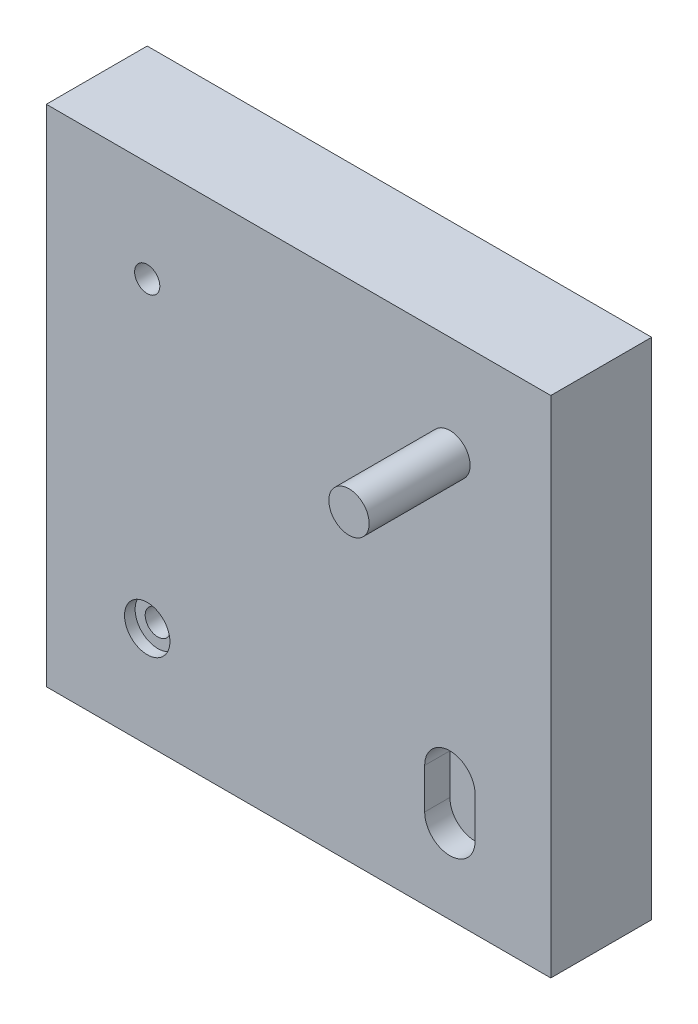
ISO-10303-21;
HEADER;
FILE_DESCRIPTION(('STEP AP214'),'2;1');
FILE_NAME('part.step','',(''),(''),'','','');
FILE_SCHEMA(('AUTOMOTIVE_DESIGN { 1 0 10303 214 1 1 1 1 }'));
ENDSEC;
DATA;
#1=APPLICATION_CONTEXT('core data for automotive mechanical design processes');
#2=APPLICATION_PROTOCOL_DEFINITION('international standard','automotive_design',2000,#1);
#3=PRODUCT_CONTEXT('',#1,'mechanical');
#4=PRODUCT('Part','Part','',(#3));
#5=PRODUCT_RELATED_PRODUCT_CATEGORY('part','',(#4));
#6=PRODUCT_DEFINITION_FORMATION('','',#4);
#7=PRODUCT_DEFINITION_CONTEXT('part definition',#1,'design');
#8=PRODUCT_DEFINITION('design','',#6,#7);
#9=PRODUCT_DEFINITION_SHAPE('','',#8);
#10=(LENGTH_UNIT() NAMED_UNIT(*) SI_UNIT(.MILLI.,.METRE.));
#11=(NAMED_UNIT(*) PLANE_ANGLE_UNIT() SI_UNIT($,.RADIAN.));
#12=(NAMED_UNIT(*) SI_UNIT($,.STERADIAN.) SOLID_ANGLE_UNIT());
#13=UNCERTAINTY_MEASURE_WITH_UNIT(LENGTH_MEASURE(1.E-05),#10,'distance_accuracy_value','');
#14=(GEOMETRIC_REPRESENTATION_CONTEXT(3) GLOBAL_UNCERTAINTY_ASSIGNED_CONTEXT((#13)) GLOBAL_UNIT_ASSIGNED_CONTEXT((#10,
#11,#12)) REPRESENTATION_CONTEXT('',''));
#15=CARTESIAN_POINT('',(0.,0.,0.));
#16=DIRECTION('',(0.,0.,1.));
#17=DIRECTION('',(1.,0.,0.));
#18=AXIS2_PLACEMENT_3D('',#15,#16,#17);
#19=CARTESIAN_POINT('',(50.,-50.,20.));
#20=DIRECTION('',(-1.,0.,0.));
#21=DIRECTION('',(0.,0.,1.));
#22=AXIS2_PLACEMENT_3D('',#19,#20,#21);
#23=PLANE('',#22);
#24=DIRECTION('',(0.,1.,0.));
#25=VECTOR('',#24,1.);
#26=CARTESIAN_POINT('',(50.,-50.,0.));
#27=LINE('',#26,#25);
#28=CARTESIAN_POINT('',(50.,-50.,0.));
#29=VERTEX_POINT('',#28);
#30=CARTESIAN_POINT('',(50.,50.,0.));
#31=VERTEX_POINT('',#30);
#32=EDGE_CURVE('E177',#29,#31,#27,.T.);
#33=ORIENTED_EDGE('',*,*,#32,.T.);
#34=DIRECTION('',(0.,0.,-1.));
#35=VECTOR('',#34,1.);
#36=CARTESIAN_POINT('',(50.,50.,20.));
#37=LINE('',#36,#35);
#38=CARTESIAN_POINT('',(50.,50.,20.));
#39=VERTEX_POINT('',#38);
#40=EDGE_CURVE('E48',#39,#31,#37,.T.);
#41=ORIENTED_EDGE('',*,*,#40,.F.);
#42=DIRECTION('',(0.,1.,0.));
#43=VECTOR('',#42,1.);
#44=CARTESIAN_POINT('',(50.,-50.,20.));
#45=LINE('',#44,#43);
#46=CARTESIAN_POINT('',(50.,-50.,20.));
#47=VERTEX_POINT('',#46);
#48=EDGE_CURVE('E178',#47,#39,#45,.T.);
#49=ORIENTED_EDGE('',*,*,#48,.F.);
#50=DIRECTION('',(0.,0.,-1.));
#51=VECTOR('',#50,1.);
#52=CARTESIAN_POINT('',(50.,-50.,20.));
#53=LINE('',#52,#51);
#54=EDGE_CURVE('E184',#47,#29,#53,.T.);
#55=ORIENTED_EDGE('',*,*,#54,.T.);
#56=EDGE_LOOP('',(#33,#41,#49,#55));
#57=FACE_BOUND('',#56,.T.);
#58=ADVANCED_FACE('F41',(#57),#23,.F.);
#59=CARTESIAN_POINT('',(-50.,50.,20.));
#60=DIRECTION('',(0.,-1.,0.));
#61=DIRECTION('',(0.,0.,-1.));
#62=AXIS2_PLACEMENT_3D('',#59,#60,#61);
#63=PLANE('',#62);
#64=DIRECTION('',(-1.,0.,0.));
#65=VECTOR('',#64,1.);
#66=CARTESIAN_POINT('',(-50.,50.,0.));
#67=LINE('',#66,#65);
#68=CARTESIAN_POINT('',(-50.,50.,0.));
#69=VERTEX_POINT('',#68);
#70=EDGE_CURVE('E187',#31,#69,#67,.T.);
#71=ORIENTED_EDGE('',*,*,#70,.T.);
#72=DIRECTION('',(0.,0.,-1.));
#73=VECTOR('',#72,1.);
#74=CARTESIAN_POINT('',(-50.,50.,20.));
#75=LINE('',#74,#73);
#76=CARTESIAN_POINT('',(-50.,50.,20.));
#77=VERTEX_POINT('',#76);
#78=EDGE_CURVE('E195',#77,#69,#75,.T.);
#79=ORIENTED_EDGE('',*,*,#78,.F.);
#80=DIRECTION('',(-1.,0.,0.));
#81=VECTOR('',#80,1.);
#82=CARTESIAN_POINT('',(-50.,50.,20.));
#83=LINE('',#82,#81);
#84=EDGE_CURVE('E93',#39,#77,#83,.T.);
#85=ORIENTED_EDGE('',*,*,#84,.F.);
#86=ORIENTED_EDGE('',*,*,#40,.T.);
#87=EDGE_LOOP('',(#71,#79,#85,#86));
#88=FACE_BOUND('',#87,.T.);
#89=ADVANCED_FACE('F198',(#88),#63,.F.);
#90=CARTESIAN_POINT('',(-50.,-50.,20.));
#91=DIRECTION('',(1.,0.,0.));
#92=DIRECTION('',(0.,0.,-1.));
#93=AXIS2_PLACEMENT_3D('',#90,#91,#92);
#94=PLANE('',#93);
#95=DIRECTION('',(0.,-1.,0.));
#96=VECTOR('',#95,1.);
#97=CARTESIAN_POINT('',(-50.,-50.,0.));
#98=LINE('',#97,#96);
#99=CARTESIAN_POINT('',(-50.,-50.,0.));
#100=VERTEX_POINT('',#99);
#101=EDGE_CURVE('E189',#69,#100,#98,.T.);
#102=ORIENTED_EDGE('',*,*,#101,.T.);
#103=DIRECTION('',(0.,0.,-1.));
#104=VECTOR('',#103,1.);
#105=CARTESIAN_POINT('',(-50.,-50.,20.));
#106=LINE('',#105,#104);
#107=CARTESIAN_POINT('',(-50.,-50.,20.));
#108=VERTEX_POINT('',#107);
#109=EDGE_CURVE('E193',#108,#100,#106,.T.);
#110=ORIENTED_EDGE('',*,*,#109,.F.);
#111=DIRECTION('',(0.,-1.,0.));
#112=VECTOR('',#111,1.);
#113=CARTESIAN_POINT('',(-50.,-50.,20.));
#114=LINE('',#113,#112);
#115=EDGE_CURVE('E181',#77,#108,#114,.T.);
#116=ORIENTED_EDGE('',*,*,#115,.F.);
#117=ORIENTED_EDGE('',*,*,#78,.T.);
#118=EDGE_LOOP('',(#102,#110,#116,#117));
#119=FACE_BOUND('',#118,.T.);
#120=ADVANCED_FACE('F207',(#119),#94,.F.);
#121=CARTESIAN_POINT('',(-50.,-50.,20.));
#122=DIRECTION('',(0.,1.,0.));
#123=DIRECTION('',(0.,0.,1.));
#124=AXIS2_PLACEMENT_3D('',#121,#122,#123);
#125=PLANE('',#124);
#126=DIRECTION('',(1.,0.,0.));
#127=VECTOR('',#126,1.);
#128=CARTESIAN_POINT('',(-50.,-50.,0.));
#129=LINE('',#128,#127);
#130=EDGE_CURVE('E85',#100,#29,#129,.T.);
#131=ORIENTED_EDGE('',*,*,#130,.T.);
#132=ORIENTED_EDGE('',*,*,#54,.F.);
#133=DIRECTION('',(1.,0.,0.));
#134=VECTOR('',#133,1.);
#135=CARTESIAN_POINT('',(-50.,-50.,20.));
#136=LINE('',#135,#134);
#137=EDGE_CURVE('E64',#108,#47,#136,.T.);
#138=ORIENTED_EDGE('',*,*,#137,.F.);
#139=ORIENTED_EDGE('',*,*,#109,.T.);
#140=EDGE_LOOP('',(#131,#132,#138,#139));
#141=FACE_BOUND('',#140,.T.);
#142=ADVANCED_FACE('F209',(#141),#125,.F.);
#143=CARTESIAN_POINT('',(0.,0.,20.));
#144=DIRECTION('',(0.,0.,-1.));
#145=DIRECTION('',(-1.,0.,0.));
#146=AXIS2_PLACEMENT_3D('',#143,#144,#145);
#147=PLANE('',#146);
#148=DIRECTION('',(0.,1.,0.));
#149=VECTOR('',#148,1.);
#150=CARTESIAN_POINT('',(35.,-34.,20.));
#151=LINE('',#150,#149);
#152=CARTESIAN_POINT('',(35.,-34.,20.));
#153=VERTEX_POINT('',#152);
#154=CARTESIAN_POINT('',(35.,-26.,20.));
#155=VERTEX_POINT('',#154);
#156=EDGE_CURVE('E147',#153,#155,#151,.T.);
#157=ORIENTED_EDGE('',*,*,#156,.F.);
#158=CARTESIAN_POINT('',(30.,-34.,20.));
#159=DIRECTION('',(0.,0.,1.));
#160=DIRECTION('',(1.,0.,0.));
#161=AXIS2_PLACEMENT_3D('',#158,#159,#160);
#162=CIRCLE('',#161,5.);
#163=CARTESIAN_POINT('',(25.,-34.,20.));
#164=VERTEX_POINT('',#163);
#165=EDGE_CURVE('E55',#164,#153,#162,.T.);
#166=ORIENTED_EDGE('',*,*,#165,.F.);
#167=DIRECTION('',(0.,-1.,0.));
#168=VECTOR('',#167,1.);
#169=CARTESIAN_POINT('',(25.,-34.,20.));
#170=LINE('',#169,#168);
#171=CARTESIAN_POINT('',(25.,-26.,20.));
#172=VERTEX_POINT('',#171);
#173=EDGE_CURVE('E138',#172,#164,#170,.T.);
#174=ORIENTED_EDGE('',*,*,#173,.F.);
#175=CARTESIAN_POINT('',(30.,-26.,20.));
#176=DIRECTION('',(0.,0.,1.));
#177=DIRECTION('',(1.,0.,0.));
#178=AXIS2_PLACEMENT_3D('',#175,#176,#177);
#179=CIRCLE('',#178,5.);
#180=EDGE_CURVE('E141',#155,#172,#179,.T.);
#181=ORIENTED_EDGE('',*,*,#180,.F.);
#182=EDGE_LOOP('',(#157,#166,#174,#181));
#183=FACE_BOUND('',#182,.T.);
#184=CARTESIAN_POINT('',(-30.,-30.,20.));
#185=DIRECTION('',(0.,0.,1.));
#186=DIRECTION('',(1.,0.,0.));
#187=AXIS2_PLACEMENT_3D('',#184,#185,#186);
#188=CIRCLE('',#187,4.5);
#189=CARTESIAN_POINT('',(-25.5,-30.,20.));
#190=VERTEX_POINT('',#189);
#191=EDGE_CURVE('E153',#190,#190,#188,.T.);
#192=ORIENTED_EDGE('',*,*,#191,.F.);
#193=EDGE_LOOP('',(#192));
#194=FACE_BOUND('',#193,.T.);
#195=CARTESIAN_POINT('',(30.,30.,20.));
#196=DIRECTION('',(0.,0.,-1.));
#197=DIRECTION('',(-1.,0.,0.));
#198=AXIS2_PLACEMENT_3D('',#195,#196,#197);
#199=CIRCLE('',#198,4.00000000000001);
#200=CARTESIAN_POINT('',(26.,30.,20.));
#201=VERTEX_POINT('',#200);
#202=EDGE_CURVE('E11',#201,#201,#199,.F.);
#203=ORIENTED_EDGE('',*,*,#202,.F.);
#204=EDGE_LOOP('',(#203));
#205=FACE_BOUND('',#204,.T.);
#206=CARTESIAN_POINT('',(-30.,30.,20.));
#207=DIRECTION('',(0.,0.,1.));
#208=DIRECTION('',(1.,0.,0.));
#209=AXIS2_PLACEMENT_3D('',#206,#207,#208);
#210=CIRCLE('',#209,2.5);
#211=CARTESIAN_POINT('',(-27.5,30.,20.));
#212=VERTEX_POINT('',#211);
#213=EDGE_CURVE('E171',#212,#212,#210,.T.);
#214=ORIENTED_EDGE('',*,*,#213,.F.);
#215=EDGE_LOOP('',(#214));
#216=FACE_BOUND('',#215,.T.);
#217=ORIENTED_EDGE('',*,*,#48,.T.);
#218=ORIENTED_EDGE('',*,*,#84,.T.);
#219=ORIENTED_EDGE('',*,*,#115,.T.);
#220=ORIENTED_EDGE('',*,*,#137,.T.);
#221=EDGE_LOOP('',(#217,#218,#219,#220));
#222=FACE_BOUND('',#221,.T.);
#223=ADVANCED_FACE('F210',(#183,#194,#205,#216,#222),#147,.F.);
#224=CARTESIAN_POINT('',(0.,0.,0.));
#225=DIRECTION('',(0.,0.,-1.));
#226=DIRECTION('',(-1.,0.,0.));
#227=AXIS2_PLACEMENT_3D('',#224,#225,#226);
#228=PLANE('',#227);
#229=CARTESIAN_POINT('',(-30.,-30.,0.));
#230=DIRECTION('',(0.,0.,1.));
#231=DIRECTION('',(1.,0.,0.));
#232=AXIS2_PLACEMENT_3D('',#229,#230,#231);
#233=CIRCLE('',#232,2.5);
#234=CARTESIAN_POINT('',(-27.5,-30.,0.));
#235=VERTEX_POINT('',#234);
#236=EDGE_CURVE('E165',#235,#235,#233,.T.);
#237=ORIENTED_EDGE('',*,*,#236,.T.);
#238=EDGE_LOOP('',(#237));
#239=FACE_BOUND('',#238,.T.);
#240=ORIENTED_EDGE('',*,*,#32,.F.);
#241=ORIENTED_EDGE('',*,*,#130,.F.);
#242=ORIENTED_EDGE('',*,*,#101,.F.);
#243=ORIENTED_EDGE('',*,*,#70,.F.);
#244=EDGE_LOOP('',(#240,#241,#242,#243));
#245=FACE_BOUND('',#244,.T.);
#246=ADVANCED_FACE('F203',(#239,#245),#228,.T.);
#247=CARTESIAN_POINT('',(-30.,30.,11.5));
#248=DIRECTION('',(0.,0.,1.));
#249=DIRECTION('',(1.,0.,0.));
#250=AXIS2_PLACEMENT_3D('',#247,#248,#249);
#251=CONICAL_SURFACE('',#250,2.5,1.02974425867665);
#252=CARTESIAN_POINT('',(-30.,30.,9.9978484524311));
#253=VERTEX_POINT('',#252);
#254=VERTEX_LOOP('',#253);
#255=FACE_BOUND('',#254,.T.);
#256=CARTESIAN_POINT('',(-30.,30.,11.5));
#257=DIRECTION('',(0.,0.,1.));
#258=DIRECTION('',(1.,0.,0.));
#259=AXIS2_PLACEMENT_3D('',#256,#257,#258);
#260=CIRCLE('',#259,2.5);
#261=CARTESIAN_POINT('',(-27.5,30.,11.5));
#262=VERTEX_POINT('',#261);
#263=EDGE_CURVE('E174',#262,#262,#260,.T.);
#264=ORIENTED_EDGE('',*,*,#263,.T.);
#265=EDGE_LOOP('',(#264));
#266=FACE_BOUND('',#265,.T.);
#267=ADVANCED_FACE('F219',(#255,#266),#251,.F.);
#268=CARTESIAN_POINT('',(-30.,30.,20.));
#269=DIRECTION('',(0.,0.,1.));
#270=DIRECTION('',(1.,0.,0.));
#271=AXIS2_PLACEMENT_3D('',#268,#269,#270);
#272=CYLINDRICAL_SURFACE('',#271,2.5);
#273=ORIENTED_EDGE('',*,*,#263,.F.);
#274=EDGE_LOOP('',(#273));
#275=FACE_BOUND('',#274,.T.);
#276=ORIENTED_EDGE('',*,*,#213,.T.);
#277=EDGE_LOOP('',(#276));
#278=FACE_BOUND('',#277,.T.);
#279=ADVANCED_FACE('F248',(#275,#278),#272,.F.);
#280=CARTESIAN_POINT('',(30.,30.,40.));
#281=DIRECTION('',(0.,0.,-1.));
#282=DIRECTION('',(-1.,0.,0.));
#283=AXIS2_PLACEMENT_3D('',#280,#281,#282);
#284=CYLINDRICAL_SURFACE('',#283,4.00000000000001);
#285=CARTESIAN_POINT('',(30.,30.,40.));
#286=DIRECTION('',(0.,0.,1.));
#287=DIRECTION('',(1.,0.,0.));
#288=AXIS2_PLACEMENT_3D('',#285,#286,#287);
#289=CIRCLE('',#288,4.00000000000001);
#290=CARTESIAN_POINT('',(34.,30.,40.));
#291=VERTEX_POINT('',#290);
#292=EDGE_CURVE('E168',#291,#291,#289,.T.);
#293=ORIENTED_EDGE('',*,*,#292,.F.);
#294=EDGE_LOOP('',(#293));
#295=FACE_BOUND('',#294,.T.);
#296=ORIENTED_EDGE('',*,*,#202,.T.);
#297=EDGE_LOOP('',(#296));
#298=FACE_BOUND('',#297,.T.);
#299=ADVANCED_FACE('F257',(#295,#298),#284,.T.);
#300=CARTESIAN_POINT('',(30.,30.,40.));
#301=DIRECTION('',(0.,0.,1.));
#302=DIRECTION('',(1.,0.,0.));
#303=AXIS2_PLACEMENT_3D('',#300,#301,#302);
#304=PLANE('',#303);
#305=ORIENTED_EDGE('',*,*,#292,.T.);
#306=EDGE_LOOP('',(#305));
#307=FACE_BOUND('',#306,.T.);
#308=ADVANCED_FACE('F266',(#307),#304,.T.);
#309=CARTESIAN_POINT('',(-30.,-30.,20.));
#310=DIRECTION('',(0.,0.,1.));
#311=DIRECTION('',(1.,0.,0.));
#312=AXIS2_PLACEMENT_3D('',#309,#310,#311);
#313=CYLINDRICAL_SURFACE('',#312,2.50000000000001);
#314=ORIENTED_EDGE('',*,*,#236,.F.);
#315=EDGE_LOOP('',(#314));
#316=FACE_BOUND('',#315,.T.);
#317=CARTESIAN_POINT('',(-30.,-30.,17.9));
#318=DIRECTION('',(0.,0.,1.));
#319=DIRECTION('',(1.,0.,0.));
#320=AXIS2_PLACEMENT_3D('',#317,#318,#319);
#321=CIRCLE('',#320,2.50000000000001);
#322=CARTESIAN_POINT('',(-27.5,-30.,17.9));
#323=VERTEX_POINT('',#322);
#324=EDGE_CURVE('E162',#323,#323,#321,.T.);
#325=ORIENTED_EDGE('',*,*,#324,.T.);
#326=EDGE_LOOP('',(#325));
#327=FACE_BOUND('',#326,.T.);
#328=ADVANCED_FACE('F274',(#316,#327),#313,.F.);
#329=CARTESIAN_POINT('',(-27.5,-30.,17.9));
#330=DIRECTION('',(0.,0.,-1.));
#331=DIRECTION('',(-1.,0.,0.));
#332=AXIS2_PLACEMENT_3D('',#329,#330,#331);
#333=PLANE('',#332);
#334=ORIENTED_EDGE('',*,*,#324,.F.);
#335=EDGE_LOOP('',(#334));
#336=FACE_BOUND('',#335,.T.);
#337=CARTESIAN_POINT('',(-30.,-30.,17.9));
#338=DIRECTION('',(0.,0.,1.));
#339=DIRECTION('',(1.,0.,0.));
#340=AXIS2_PLACEMENT_3D('',#337,#338,#339);
#341=CIRCLE('',#340,4.5);
#342=CARTESIAN_POINT('',(-25.5,-30.,17.9));
#343=VERTEX_POINT('',#342);
#344=EDGE_CURVE('E159',#343,#343,#341,.T.);
#345=ORIENTED_EDGE('',*,*,#344,.T.);
#346=EDGE_LOOP('',(#345));
#347=FACE_BOUND('',#346,.T.);
#348=ADVANCED_FACE('F288',(#336,#347),#333,.F.);
#349=CARTESIAN_POINT('',(-30.,-30.,20.));
#350=DIRECTION('',(0.,0.,1.));
#351=DIRECTION('',(1.,0.,0.));
#352=AXIS2_PLACEMENT_3D('',#349,#350,#351);
#353=CYLINDRICAL_SURFACE('',#352,4.5);
#354=ORIENTED_EDGE('',*,*,#344,.F.);
#355=EDGE_LOOP('',(#354));
#356=FACE_BOUND('',#355,.T.);
#357=ORIENTED_EDGE('',*,*,#191,.T.);
#358=EDGE_LOOP('',(#357));
#359=FACE_BOUND('',#358,.T.);
#360=ADVANCED_FACE('F296',(#356,#359),#353,.F.);
#361=CARTESIAN_POINT('',(30.,-34.,15.));
#362=DIRECTION('',(0.,0.,1.));
#363=DIRECTION('',(1.,0.,0.));
#364=AXIS2_PLACEMENT_3D('',#361,#362,#363);
#365=CYLINDRICAL_SURFACE('',#364,5.);
#366=ORIENTED_EDGE('',*,*,#165,.T.);
#367=DIRECTION('',(0.,0.,1.));
#368=VECTOR('',#367,1.);
#369=CARTESIAN_POINT('',(35.,-34.,15.));
#370=LINE('',#369,#368);
#371=CARTESIAN_POINT('',(35.,-34.,15.));
#372=VERTEX_POINT('',#371);
#373=EDGE_CURVE('E116',#372,#153,#370,.T.);
#374=ORIENTED_EDGE('',*,*,#373,.F.);
#375=CARTESIAN_POINT('',(30.,-34.,15.));
#376=DIRECTION('',(0.,0.,1.));
#377=DIRECTION('',(1.,0.,0.));
#378=AXIS2_PLACEMENT_3D('',#375,#376,#377);
#379=CIRCLE('',#378,5.);
#380=CARTESIAN_POINT('',(25.,-34.,15.));
#381=VERTEX_POINT('',#380);
#382=EDGE_CURVE('E120',#381,#372,#379,.T.);
#383=ORIENTED_EDGE('',*,*,#382,.F.);
#384=DIRECTION('',(0.,0.,1.));
#385=VECTOR('',#384,1.);
#386=CARTESIAN_POINT('',(25.,-34.,15.));
#387=LINE('',#386,#385);
#388=EDGE_CURVE('E151',#381,#164,#387,.T.);
#389=ORIENTED_EDGE('',*,*,#388,.T.);
#390=EDGE_LOOP('',(#366,#374,#383,#389));
#391=FACE_BOUND('',#390,.T.);
#392=ADVANCED_FACE('F118',(#391),#365,.F.);
#393=CARTESIAN_POINT('',(25.,-34.,15.));
#394=DIRECTION('',(-1.,0.,0.));
#395=DIRECTION('',(0.,0.,1.));
#396=AXIS2_PLACEMENT_3D('',#393,#394,#395);
#397=PLANE('',#396);
#398=ORIENTED_EDGE('',*,*,#173,.T.);
#399=ORIENTED_EDGE('',*,*,#388,.F.);
#400=DIRECTION('',(0.,-1.,0.));
#401=VECTOR('',#400,1.);
#402=CARTESIAN_POINT('',(25.,-34.,15.));
#403=LINE('',#402,#401);
#404=CARTESIAN_POINT('',(25.,-26.,15.));
#405=VERTEX_POINT('',#404);
#406=EDGE_CURVE('E126',#405,#381,#403,.T.);
#407=ORIENTED_EDGE('',*,*,#406,.F.);
#408=DIRECTION('',(0.,0.,1.));
#409=VECTOR('',#408,1.);
#410=CARTESIAN_POINT('',(25.,-26.,15.));
#411=LINE('',#410,#409);
#412=EDGE_CURVE('E154',#405,#172,#411,.T.);
#413=ORIENTED_EDGE('',*,*,#412,.T.);
#414=EDGE_LOOP('',(#398,#399,#407,#413));
#415=FACE_BOUND('',#414,.T.);
#416=ADVANCED_FACE('F315',(#415),#397,.F.);
#417=CARTESIAN_POINT('',(30.,-26.,15.));
#418=DIRECTION('',(0.,0.,1.));
#419=DIRECTION('',(1.,0.,0.));
#420=AXIS2_PLACEMENT_3D('',#417,#418,#419);
#421=CYLINDRICAL_SURFACE('',#420,5.);
#422=ORIENTED_EDGE('',*,*,#180,.T.);
#423=ORIENTED_EDGE('',*,*,#412,.F.);
#424=CARTESIAN_POINT('',(30.,-26.,15.));
#425=DIRECTION('',(0.,0.,1.));
#426=DIRECTION('',(1.,0.,0.));
#427=AXIS2_PLACEMENT_3D('',#424,#425,#426);
#428=CIRCLE('',#427,5.);
#429=CARTESIAN_POINT('',(35.,-26.,15.));
#430=VERTEX_POINT('',#429);
#431=EDGE_CURVE('E134',#430,#405,#428,.T.);
#432=ORIENTED_EDGE('',*,*,#431,.F.);
#433=DIRECTION('',(0.,0.,1.));
#434=VECTOR('',#433,1.);
#435=CARTESIAN_POINT('',(35.,-26.,15.));
#436=LINE('',#435,#434);
#437=EDGE_CURVE('E125',#430,#155,#436,.T.);
#438=ORIENTED_EDGE('',*,*,#437,.T.);
#439=EDGE_LOOP('',(#422,#423,#432,#438));
#440=FACE_BOUND('',#439,.T.);
#441=ADVANCED_FACE('F324',(#440),#421,.F.);
#442=CARTESIAN_POINT('',(35.,-34.,15.));
#443=DIRECTION('',(1.,0.,0.));
#444=DIRECTION('',(0.,0.,-1.));
#445=AXIS2_PLACEMENT_3D('',#442,#443,#444);
#446=PLANE('',#445);
#447=ORIENTED_EDGE('',*,*,#156,.T.);
#448=ORIENTED_EDGE('',*,*,#437,.F.);
#449=DIRECTION('',(0.,1.,0.));
#450=VECTOR('',#449,1.);
#451=CARTESIAN_POINT('',(35.,-34.,15.));
#452=LINE('',#451,#450);
#453=EDGE_CURVE('E129',#372,#430,#452,.T.);
#454=ORIENTED_EDGE('',*,*,#453,.F.);
#455=ORIENTED_EDGE('',*,*,#373,.T.);
#456=EDGE_LOOP('',(#447,#448,#454,#455));
#457=FACE_BOUND('',#456,.T.);
#458=ADVANCED_FACE('F130',(#457),#446,.F.);
#459=CARTESIAN_POINT('',(30.,-34.,15.));
#460=DIRECTION('',(0.,0.,1.));
#461=DIRECTION('',(1.,0.,0.));
#462=AXIS2_PLACEMENT_3D('',#459,#460,#461);
#463=PLANE('',#462);
#464=ORIENTED_EDGE('',*,*,#382,.T.);
#465=ORIENTED_EDGE('',*,*,#453,.T.);
#466=ORIENTED_EDGE('',*,*,#431,.T.);
#467=ORIENTED_EDGE('',*,*,#406,.T.);
#468=EDGE_LOOP('',(#464,#465,#466,#467));
#469=FACE_BOUND('',#468,.T.);
#470=ADVANCED_FACE('F136',(#469),#463,.T.);
#471=CLOSED_SHELL('',(#58,#89,#120,#142,#223,#246,#267,#279,#299,#308,#328,#348,#360,#392,#416,
#441,#458,#470));
#472=MANIFOLD_SOLID_BREP('B2',#471);
#473=ADVANCED_BREP_SHAPE_REPRESENTATION('',(#18,#472),#14);
#474=SHAPE_DEFINITION_REPRESENTATION(#9,#473);
ENDSEC;
END-ISO-10303-21;
